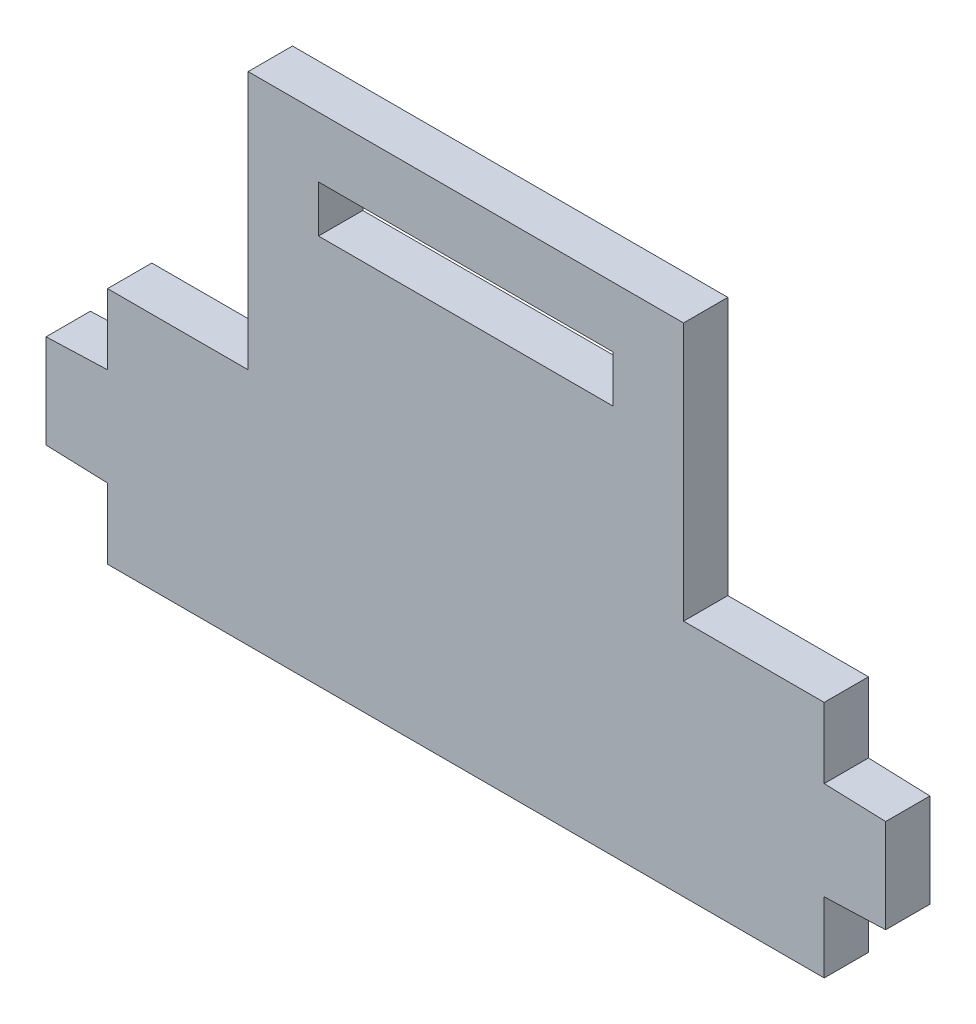
ISO-10303-21;
HEADER;
FILE_DESCRIPTION(('STEP AP214'),'2;1');
FILE_NAME('part.step','',(''),(''),'','','');
FILE_SCHEMA(('AUTOMOTIVE_DESIGN { 1 0 10303 214 1 1 1 1 }'));
ENDSEC;
DATA;
#1=APPLICATION_CONTEXT('core data for automotive mechanical design processes');
#2=APPLICATION_PROTOCOL_DEFINITION('international standard','automotive_design',2000,#1);
#3=PRODUCT_CONTEXT('',#1,'mechanical');
#4=PRODUCT('Part','Part','',(#3));
#5=PRODUCT_RELATED_PRODUCT_CATEGORY('part','',(#4));
#6=PRODUCT_DEFINITION_FORMATION('','',#4);
#7=PRODUCT_DEFINITION_CONTEXT('part definition',#1,'design');
#8=PRODUCT_DEFINITION('design','',#6,#7);
#9=PRODUCT_DEFINITION_SHAPE('','',#8);
#10=(LENGTH_UNIT() NAMED_UNIT(*) SI_UNIT(.MILLI.,.METRE.));
#11=(NAMED_UNIT(*) PLANE_ANGLE_UNIT() SI_UNIT($,.RADIAN.));
#12=(NAMED_UNIT(*) SI_UNIT($,.STERADIAN.) SOLID_ANGLE_UNIT());
#13=UNCERTAINTY_MEASURE_WITH_UNIT(LENGTH_MEASURE(1.E-05),#10,'distance_accuracy_value','');
#14=(GEOMETRIC_REPRESENTATION_CONTEXT(3) GLOBAL_UNCERTAINTY_ASSIGNED_CONTEXT((#13)) GLOBAL_UNIT_ASSIGNED_CONTEXT((#10,
#11,#12)) REPRESENTATION_CONTEXT('',''));
#15=CARTESIAN_POINT('',(0.,0.,0.));
#16=DIRECTION('',(0.,0.,1.));
#17=DIRECTION('',(1.,0.,0.));
#18=AXIS2_PLACEMENT_3D('',#15,#16,#17);
#19=CARTESIAN_POINT('',(48.5352783658156,182.165275629568,8.53999999997227));
#20=DIRECTION('',(1.,0.,0.));
#21=DIRECTION('',(0.,1.,0.));
#22=AXIS2_PLACEMENT_3D('',#19,#20,#21);
#23=PLANE('',#22);
#24=DIRECTION('',(0.,-1.,0.));
#25=VECTOR('',#24,1.);
#26=CARTESIAN_POINT('',(48.5352783658156,182.165275629568,2.53999999997227));
#27=LINE('',#26,#25);
#28=CARTESIAN_POINT('',(48.5352783658156,182.165275629568,2.53999999997227));
#29=VERTEX_POINT('',#28);
#30=CARTESIAN_POINT('',(48.5352783658156,172.640275629568,2.53999999997227));
#31=VERTEX_POINT('',#30);
#32=EDGE_CURVE('E203',#29,#31,#27,.T.);
#33=ORIENTED_EDGE('',*,*,#32,.F.);
#34=DIRECTION('',(0.,0.,-1.));
#35=VECTOR('',#34,1.);
#36=CARTESIAN_POINT('',(48.5352783658156,182.165275629568,8.53999999997227));
#37=LINE('',#36,#35);
#38=CARTESIAN_POINT('',(48.5352783658156,182.165275629568,8.53999999997227));
#39=VERTEX_POINT('',#38);
#40=EDGE_CURVE('E11',#39,#29,#37,.T.);
#41=ORIENTED_EDGE('',*,*,#40,.F.);
#42=DIRECTION('',(0.,-1.,0.));
#43=VECTOR('',#42,1.);
#44=CARTESIAN_POINT('',(48.5352783658156,182.165275629568,8.53999999997227));
#45=LINE('',#44,#43);
#46=CARTESIAN_POINT('',(48.5352783658156,172.640275629568,8.53999999997227));
#47=VERTEX_POINT('',#46);
#48=EDGE_CURVE('E207',#39,#47,#45,.T.);
#49=ORIENTED_EDGE('',*,*,#48,.T.);
#50=DIRECTION('',(0.,0.,-1.));
#51=VECTOR('',#50,1.);
#52=CARTESIAN_POINT('',(48.5352783658156,172.640275629568,8.53999999997227));
#53=LINE('',#52,#51);
#54=EDGE_CURVE('E36',#47,#31,#53,.T.);
#55=ORIENTED_EDGE('',*,*,#54,.T.);
#56=EDGE_LOOP('',(#33,#41,#49,#55));
#57=FACE_BOUND('',#56,.T.);
#58=ADVANCED_FACE('F33',(#57),#23,.T.);
#59=CARTESIAN_POINT('',(48.5352783658156,182.165275629568,8.53999999997227));
#60=DIRECTION('',(0.0348994967023862,-0.9993908270191,0.));
#61=DIRECTION('',(0.9993908270191,0.0348994967023862,0.));
#62=AXIS2_PLACEMENT_3D('',#59,#60,#61);
#63=PLANE('',#62);
#64=DIRECTION('',(-0.9993908270191,-0.0348994967023862,0.));
#65=VECTOR('',#64,1.);
#66=CARTESIAN_POINT('',(48.5352783658156,182.165275629568,2.53999999997227));
#67=LINE('',#66,#65);
#68=CARTESIAN_POINT('',(56.8598336654857,182.455975506308,2.53999999997227));
#69=VERTEX_POINT('',#68);
#70=EDGE_CURVE('E211',#69,#29,#67,.T.);
#71=ORIENTED_EDGE('',*,*,#70,.F.);
#72=DIRECTION('',(0.,0.,-1.));
#73=VECTOR('',#72,1.);
#74=CARTESIAN_POINT('',(56.8598336654857,182.455975506308,8.53999999997227));
#75=LINE('',#74,#73);
#76=CARTESIAN_POINT('',(56.8598336654857,182.455975506308,8.53999999997227));
#77=VERTEX_POINT('',#76);
#78=EDGE_CURVE('E41',#77,#69,#75,.T.);
#79=ORIENTED_EDGE('',*,*,#78,.F.);
#80=DIRECTION('',(-0.9993908270191,-0.0348994967023862,0.));
#81=VECTOR('',#80,1.);
#82=CARTESIAN_POINT('',(48.5352783658156,182.165275629568,8.53999999997227));
#83=LINE('',#82,#81);
#84=EDGE_CURVE('E253',#77,#39,#83,.T.);
#85=ORIENTED_EDGE('',*,*,#84,.T.);
#86=ORIENTED_EDGE('',*,*,#40,.T.);
#87=EDGE_LOOP('',(#71,#79,#85,#86));
#88=FACE_BOUND('',#87,.T.);
#89=ADVANCED_FACE('F340',(#88),#63,.T.);
#90=CARTESIAN_POINT('',(56.8598336654857,182.455975506308,8.53999999997227));
#91=DIRECTION('',(1.,0.,0.));
#92=DIRECTION('',(0.,1.,0.));
#93=AXIS2_PLACEMENT_3D('',#90,#91,#92);
#94=PLANE('',#93);
#95=DIRECTION('',(0.,-1.,0.));
#96=VECTOR('',#95,1.);
#97=CARTESIAN_POINT('',(56.8598336654857,182.455975506308,2.53999999997227));
#98=LINE('',#97,#96);
#99=CARTESIAN_POINT('',(56.8598336654857,195.155975506308,2.53999999997227));
#100=VERTEX_POINT('',#99);
#101=EDGE_CURVE('E297',#100,#69,#98,.T.);
#102=ORIENTED_EDGE('',*,*,#101,.F.);
#103=DIRECTION('',(0.,0.,-1.));
#104=VECTOR('',#103,1.);
#105=CARTESIAN_POINT('',(56.8598336654857,195.155975506308,8.53999999997227));
#106=LINE('',#105,#104);
#107=CARTESIAN_POINT('',(56.8598336654857,195.155975506308,8.53999999997227));
#108=VERTEX_POINT('',#107);
#109=EDGE_CURVE('E303',#108,#100,#106,.T.);
#110=ORIENTED_EDGE('',*,*,#109,.F.);
#111=DIRECTION('',(0.,-1.,0.));
#112=VECTOR('',#111,1.);
#113=CARTESIAN_POINT('',(56.8598336654857,182.455975506308,8.53999999997227));
#114=LINE('',#113,#112);
#115=EDGE_CURVE('E250',#108,#77,#114,.T.);
#116=ORIENTED_EDGE('',*,*,#115,.T.);
#117=ORIENTED_EDGE('',*,*,#78,.T.);
#118=EDGE_LOOP('',(#102,#110,#116,#117));
#119=FACE_BOUND('',#118,.T.);
#120=ADVANCED_FACE('F391',(#119),#94,.T.);
#121=CARTESIAN_POINT('',(56.8598336654857,195.155975506308,8.53999999997227));
#122=DIRECTION('',(0.0348994967024962,0.999390827019096,0.));
#123=DIRECTION('',(-0.999390827019096,0.0348994967024962,0.));
#124=AXIS2_PLACEMENT_3D('',#121,#122,#123);
#125=PLANE('',#124);
#126=DIRECTION('',(0.999390827019096,-0.0348994967024961,0.));
#127=VECTOR('',#126,1.);
#128=CARTESIAN_POINT('',(56.8598336654857,195.155975506308,2.53999999997227));
#129=LINE('',#128,#127);
#130=CARTESIAN_POINT('',(48.5352783658156,195.446675383049,2.53999999997227));
#131=VERTEX_POINT('',#130);
#132=EDGE_CURVE('E294',#131,#100,#129,.T.);
#133=ORIENTED_EDGE('',*,*,#132,.F.);
#134=DIRECTION('',(0.,0.,-1.));
#135=VECTOR('',#134,1.);
#136=CARTESIAN_POINT('',(48.5352783658156,195.446675383049,8.53999999997227));
#137=LINE('',#136,#135);
#138=CARTESIAN_POINT('',(48.5352783658156,195.446675383049,8.53999999997227));
#139=VERTEX_POINT('',#138);
#140=EDGE_CURVE('E305',#139,#131,#137,.T.);
#141=ORIENTED_EDGE('',*,*,#140,.F.);
#142=DIRECTION('',(0.999390827019096,-0.0348994967024961,0.));
#143=VECTOR('',#142,1.);
#144=CARTESIAN_POINT('',(56.8598336654857,195.155975506308,8.53999999997227));
#145=LINE('',#144,#143);
#146=EDGE_CURVE('E247',#139,#108,#145,.T.);
#147=ORIENTED_EDGE('',*,*,#146,.T.);
#148=ORIENTED_EDGE('',*,*,#109,.T.);
#149=EDGE_LOOP('',(#133,#141,#147,#148));
#150=FACE_BOUND('',#149,.T.);
#151=ADVANCED_FACE('F389',(#150),#125,.T.);
#152=CARTESIAN_POINT('',(48.5352783658156,195.446675383049,8.53999999997227));
#153=DIRECTION('',(1.,0.,0.));
#154=DIRECTION('',(0.,0.,-1.));
#155=AXIS2_PLACEMENT_3D('',#152,#153,#154);
#156=PLANE('',#155);
#157=DIRECTION('',(0.,-1.,0.));
#158=VECTOR('',#157,1.);
#159=CARTESIAN_POINT('',(48.5352783658156,195.446675383049,2.53999999997227));
#160=LINE('',#159,#158);
#161=CARTESIAN_POINT('',(48.5352783658156,204.971675383049,2.53999999997227));
#162=VERTEX_POINT('',#161);
#163=EDGE_CURVE('E291',#162,#131,#160,.T.);
#164=ORIENTED_EDGE('',*,*,#163,.F.);
#165=DIRECTION('',(0.,0.,-1.));
#166=VECTOR('',#165,1.);
#167=CARTESIAN_POINT('',(48.5352783658156,204.971675383049,8.53999999997227));
#168=LINE('',#167,#166);
#169=CARTESIAN_POINT('',(48.5352783658156,204.971675383049,8.53999999997227));
#170=VERTEX_POINT('',#169);
#171=EDGE_CURVE('E307',#170,#162,#168,.T.);
#172=ORIENTED_EDGE('',*,*,#171,.F.);
#173=DIRECTION('',(0.,-1.,0.));
#174=VECTOR('',#173,1.);
#175=CARTESIAN_POINT('',(48.5352783658156,195.446675383049,8.53999999997227));
#176=LINE('',#175,#174);
#177=EDGE_CURVE('E244',#170,#139,#176,.T.);
#178=ORIENTED_EDGE('',*,*,#177,.T.);
#179=ORIENTED_EDGE('',*,*,#140,.T.);
#180=EDGE_LOOP('',(#164,#172,#178,#179));
#181=FACE_BOUND('',#180,.T.);
#182=ADVANCED_FACE('F385',(#181),#156,.T.);
#183=CARTESIAN_POINT('',(48.5352783658156,204.971675383049,8.53999999997227));
#184=DIRECTION('',(0.,1.,0.));
#185=DIRECTION('',(0.,0.,1.));
#186=AXIS2_PLACEMENT_3D('',#183,#184,#185);
#187=PLANE('',#186);
#188=DIRECTION('',(1.,0.,0.));
#189=VECTOR('',#188,1.);
#190=CARTESIAN_POINT('',(48.5352783658156,204.971675383049,2.53999999997227));
#191=LINE('',#190,#189);
#192=CARTESIAN_POINT('',(29.4852783658156,204.971675383049,2.53999999997227));
#193=VERTEX_POINT('',#192);
#194=EDGE_CURVE('E288',#193,#162,#191,.T.);
#195=ORIENTED_EDGE('',*,*,#194,.F.);
#196=DIRECTION('',(0.,0.,-1.));
#197=VECTOR('',#196,1.);
#198=CARTESIAN_POINT('',(29.4852783658156,204.971675383049,8.53999999997227));
#199=LINE('',#198,#197);
#200=CARTESIAN_POINT('',(29.4852783658156,204.971675383049,8.53999999997227));
#201=VERTEX_POINT('',#200);
#202=EDGE_CURVE('E309',#201,#193,#199,.T.);
#203=ORIENTED_EDGE('',*,*,#202,.F.);
#204=DIRECTION('',(1.,0.,0.));
#205=VECTOR('',#204,1.);
#206=CARTESIAN_POINT('',(48.5352783658156,204.971675383049,8.53999999997227));
#207=LINE('',#206,#205);
#208=EDGE_CURVE('E241',#201,#170,#207,.T.);
#209=ORIENTED_EDGE('',*,*,#208,.T.);
#210=ORIENTED_EDGE('',*,*,#171,.T.);
#211=EDGE_LOOP('',(#195,#203,#209,#210));
#212=FACE_BOUND('',#211,.T.);
#213=ADVANCED_FACE('F381',(#212),#187,.T.);
#214=CARTESIAN_POINT('',(29.4852783658156,204.971675383049,8.53999999997227));
#215=DIRECTION('',(1.,0.,0.));
#216=DIRECTION('',(0.,1.,0.));
#217=AXIS2_PLACEMENT_3D('',#214,#215,#216);
#218=PLANE('',#217);
#219=DIRECTION('',(0.,-1.,0.));
#220=VECTOR('',#219,1.);
#221=CARTESIAN_POINT('',(29.4852783658156,204.971675383049,2.53999999997227));
#222=LINE('',#221,#220);
#223=CARTESIAN_POINT('',(29.4852783658156,239.9538,2.53999999997227));
#224=VERTEX_POINT('',#223);
#225=EDGE_CURVE('E285',#224,#193,#222,.T.);
#226=ORIENTED_EDGE('',*,*,#225,.F.);
#227=DIRECTION('',(0.,0.,-1.));
#228=VECTOR('',#227,1.);
#229=CARTESIAN_POINT('',(29.4852783658156,239.9538,8.53999999997227));
#230=LINE('',#229,#228);
#231=CARTESIAN_POINT('',(29.4852783658156,239.9538,8.53999999997227));
#232=VERTEX_POINT('',#231);
#233=EDGE_CURVE('E311',#232,#224,#230,.T.);
#234=ORIENTED_EDGE('',*,*,#233,.F.);
#235=DIRECTION('',(0.,-1.,0.));
#236=VECTOR('',#235,1.);
#237=CARTESIAN_POINT('',(29.4852783658156,204.971675383049,8.53999999997227));
#238=LINE('',#237,#236);
#239=EDGE_CURVE('E238',#232,#201,#238,.T.);
#240=ORIENTED_EDGE('',*,*,#239,.T.);
#241=ORIENTED_EDGE('',*,*,#202,.T.);
#242=EDGE_LOOP('',(#226,#234,#240,#241));
#243=FACE_BOUND('',#242,.T.);
#244=ADVANCED_FACE('F377',(#243),#218,.T.);
#245=CARTESIAN_POINT('',(-29.4852783658156,239.9538,8.53999999997227));
#246=DIRECTION('',(0.,1.,0.));
#247=DIRECTION('',(-1.,0.,0.));
#248=AXIS2_PLACEMENT_3D('',#245,#246,#247);
#249=PLANE('',#248);
#250=DIRECTION('',(1.,0.,0.));
#251=VECTOR('',#250,1.);
#252=CARTESIAN_POINT('',(-29.4852783658156,239.9538,2.53999999997227));
#253=LINE('',#252,#251);
#254=CARTESIAN_POINT('',(-29.4852783658156,239.9538,2.53999999997227));
#255=VERTEX_POINT('',#254);
#256=EDGE_CURVE('E282',#255,#224,#253,.T.);
#257=ORIENTED_EDGE('',*,*,#256,.F.);
#258=DIRECTION('',(0.,0.,-1.));
#259=VECTOR('',#258,1.);
#260=CARTESIAN_POINT('',(-29.4852783658156,239.9538,8.53999999997227));
#261=LINE('',#260,#259);
#262=CARTESIAN_POINT('',(-29.4852783658156,239.9538,8.53999999997227));
#263=VERTEX_POINT('',#262);
#264=EDGE_CURVE('E313',#263,#255,#261,.T.);
#265=ORIENTED_EDGE('',*,*,#264,.F.);
#266=DIRECTION('',(1.,0.,0.));
#267=VECTOR('',#266,1.);
#268=CARTESIAN_POINT('',(-29.4852783658156,239.9538,8.53999999997227));
#269=LINE('',#268,#267);
#270=EDGE_CURVE('E235',#263,#232,#269,.T.);
#271=ORIENTED_EDGE('',*,*,#270,.T.);
#272=ORIENTED_EDGE('',*,*,#233,.T.);
#273=EDGE_LOOP('',(#257,#265,#271,#272));
#274=FACE_BOUND('',#273,.T.);
#275=ADVANCED_FACE('F373',(#274),#249,.T.);
#276=CARTESIAN_POINT('',(-29.4852783658156,204.971675383051,8.53999999997227));
#277=DIRECTION('',(-1.,0.,0.));
#278=DIRECTION('',(0.,-1.,0.));
#279=AXIS2_PLACEMENT_3D('',#276,#277,#278);
#280=PLANE('',#279);
#281=DIRECTION('',(0.,1.,0.));
#282=VECTOR('',#281,1.);
#283=CARTESIAN_POINT('',(-29.4852783658156,204.971675383051,2.53999999997227));
#284=LINE('',#283,#282);
#285=CARTESIAN_POINT('',(-29.4852783658156,204.971675383051,2.53999999997227));
#286=VERTEX_POINT('',#285);
#287=EDGE_CURVE('E279',#286,#255,#284,.T.);
#288=ORIENTED_EDGE('',*,*,#287,.F.);
#289=DIRECTION('',(0.,0.,-1.));
#290=VECTOR('',#289,1.);
#291=CARTESIAN_POINT('',(-29.4852783658156,204.971675383051,8.53999999997227));
#292=LINE('',#291,#290);
#293=CARTESIAN_POINT('',(-29.4852783658156,204.971675383051,8.53999999997227));
#294=VERTEX_POINT('',#293);
#295=EDGE_CURVE('E315',#294,#286,#292,.T.);
#296=ORIENTED_EDGE('',*,*,#295,.F.);
#297=DIRECTION('',(0.,1.,0.));
#298=VECTOR('',#297,1.);
#299=CARTESIAN_POINT('',(-29.4852783658156,204.971675383051,8.53999999997227));
#300=LINE('',#299,#298);
#301=EDGE_CURVE('E232',#294,#263,#300,.T.);
#302=ORIENTED_EDGE('',*,*,#301,.T.);
#303=ORIENTED_EDGE('',*,*,#264,.T.);
#304=EDGE_LOOP('',(#288,#296,#302,#303));
#305=FACE_BOUND('',#304,.T.);
#306=ADVANCED_FACE('F369',(#305),#280,.T.);
#307=CARTESIAN_POINT('',(-48.5352783658156,204.971675383051,8.53999999997227));
#308=DIRECTION('',(0.,1.,0.));
#309=DIRECTION('',(0.,0.,1.));
#310=AXIS2_PLACEMENT_3D('',#307,#308,#309);
#311=PLANE('',#310);
#312=DIRECTION('',(1.,0.,0.));
#313=VECTOR('',#312,1.);
#314=CARTESIAN_POINT('',(-48.5352783658156,204.971675383051,2.53999999997227));
#315=LINE('',#314,#313);
#316=CARTESIAN_POINT('',(-48.5352783658156,204.971675383051,2.53999999997227));
#317=VERTEX_POINT('',#316);
#318=EDGE_CURVE('E276',#317,#286,#315,.T.);
#319=ORIENTED_EDGE('',*,*,#318,.F.);
#320=DIRECTION('',(0.,0.,-1.));
#321=VECTOR('',#320,1.);
#322=CARTESIAN_POINT('',(-48.5352783658156,204.971675383051,8.53999999997227));
#323=LINE('',#322,#321);
#324=CARTESIAN_POINT('',(-48.5352783658156,204.971675383051,8.53999999997227));
#325=VERTEX_POINT('',#324);
#326=EDGE_CURVE('E317',#325,#317,#323,.T.);
#327=ORIENTED_EDGE('',*,*,#326,.F.);
#328=DIRECTION('',(1.,0.,0.));
#329=VECTOR('',#328,1.);
#330=CARTESIAN_POINT('',(-48.5352783658156,204.971675383051,8.53999999997227));
#331=LINE('',#330,#329);
#332=EDGE_CURVE('E229',#325,#294,#331,.T.);
#333=ORIENTED_EDGE('',*,*,#332,.T.);
#334=ORIENTED_EDGE('',*,*,#295,.T.);
#335=EDGE_LOOP('',(#319,#327,#333,#334));
#336=FACE_BOUND('',#335,.T.);
#337=ADVANCED_FACE('F365',(#336),#311,.T.);
#338=CARTESIAN_POINT('',(-48.5352783658156,195.446675383051,8.53999999997227));
#339=DIRECTION('',(-1.,0.,0.));
#340=DIRECTION('',(0.,0.,1.));
#341=AXIS2_PLACEMENT_3D('',#338,#339,#340);
#342=PLANE('',#341);
#343=DIRECTION('',(0.,1.,0.));
#344=VECTOR('',#343,1.);
#345=CARTESIAN_POINT('',(-48.5352783658156,195.446675383051,2.53999999997227));
#346=LINE('',#345,#344);
#347=CARTESIAN_POINT('',(-48.5352783658156,195.446675383051,2.53999999997227));
#348=VERTEX_POINT('',#347);
#349=EDGE_CURVE('E273',#348,#317,#346,.T.);
#350=ORIENTED_EDGE('',*,*,#349,.F.);
#351=DIRECTION('',(0.,0.,-1.));
#352=VECTOR('',#351,1.);
#353=CARTESIAN_POINT('',(-48.5352783658156,195.446675383051,8.53999999997227));
#354=LINE('',#353,#352);
#355=CARTESIAN_POINT('',(-48.5352783658156,195.446675383051,8.53999999997227));
#356=VERTEX_POINT('',#355);
#357=EDGE_CURVE('E319',#356,#348,#354,.T.);
#358=ORIENTED_EDGE('',*,*,#357,.F.);
#359=DIRECTION('',(0.,1.,0.));
#360=VECTOR('',#359,1.);
#361=CARTESIAN_POINT('',(-48.5352783658156,195.446675383051,8.53999999997227));
#362=LINE('',#361,#360);
#363=EDGE_CURVE('E226',#356,#325,#362,.T.);
#364=ORIENTED_EDGE('',*,*,#363,.T.);
#365=ORIENTED_EDGE('',*,*,#326,.T.);
#366=EDGE_LOOP('',(#350,#358,#364,#365));
#367=FACE_BOUND('',#366,.T.);
#368=ADVANCED_FACE('F361',(#367),#342,.T.);
#369=CARTESIAN_POINT('',(-56.8598336654857,195.155975506309,8.53999999997227));
#370=DIRECTION('',(-0.0348994967025228,0.999390827019095,0.));
#371=DIRECTION('',(-0.999390827019095,-0.0348994967025228,0.));
#372=AXIS2_PLACEMENT_3D('',#369,#370,#371);
#373=PLANE('',#372);
#374=DIRECTION('',(0.999390827019095,0.0348994967025228,0.));
#375=VECTOR('',#374,1.);
#376=CARTESIAN_POINT('',(-56.8598336654857,195.155975506309,2.53999999997227));
#377=LINE('',#376,#375);
#378=CARTESIAN_POINT('',(-56.8598336654857,195.155975506309,2.53999999997227));
#379=VERTEX_POINT('',#378);
#380=EDGE_CURVE('E270',#379,#348,#377,.T.);
#381=ORIENTED_EDGE('',*,*,#380,.F.);
#382=DIRECTION('',(0.,0.,-1.));
#383=VECTOR('',#382,1.);
#384=CARTESIAN_POINT('',(-56.8598336654857,195.155975506309,8.53999999997227));
#385=LINE('',#384,#383);
#386=CARTESIAN_POINT('',(-56.8598336654857,195.155975506309,8.53999999997227));
#387=VERTEX_POINT('',#386);
#388=EDGE_CURVE('E321',#387,#379,#385,.T.);
#389=ORIENTED_EDGE('',*,*,#388,.F.);
#390=DIRECTION('',(0.999390827019095,0.0348994967025228,0.));
#391=VECTOR('',#390,1.);
#392=CARTESIAN_POINT('',(-56.8598336654857,195.155975506309,8.53999999997227));
#393=LINE('',#392,#391);
#394=EDGE_CURVE('E223',#387,#356,#393,.T.);
#395=ORIENTED_EDGE('',*,*,#394,.T.);
#396=ORIENTED_EDGE('',*,*,#357,.T.);
#397=EDGE_LOOP('',(#381,#389,#395,#396));
#398=FACE_BOUND('',#397,.T.);
#399=ADVANCED_FACE('F357',(#398),#373,.T.);
#400=CARTESIAN_POINT('',(-56.8598336654857,182.455975506309,8.53999999997227));
#401=DIRECTION('',(-1.,0.,0.));
#402=DIRECTION('',(0.,0.,1.));
#403=AXIS2_PLACEMENT_3D('',#400,#401,#402);
#404=PLANE('',#403);
#405=DIRECTION('',(0.,1.,0.));
#406=VECTOR('',#405,1.);
#407=CARTESIAN_POINT('',(-56.8598336654857,182.455975506309,2.53999999997227));
#408=LINE('',#407,#406);
#409=CARTESIAN_POINT('',(-56.8598336654857,182.455975506309,2.53999999997227));
#410=VERTEX_POINT('',#409);
#411=EDGE_CURVE('E267',#410,#379,#408,.T.);
#412=ORIENTED_EDGE('',*,*,#411,.F.);
#413=DIRECTION('',(0.,0.,-1.));
#414=VECTOR('',#413,1.);
#415=CARTESIAN_POINT('',(-56.8598336654857,182.455975506309,8.53999999997227));
#416=LINE('',#415,#414);
#417=CARTESIAN_POINT('',(-56.8598336654857,182.455975506309,8.53999999997227));
#418=VERTEX_POINT('',#417);
#419=EDGE_CURVE('E323',#418,#410,#416,.T.);
#420=ORIENTED_EDGE('',*,*,#419,.F.);
#421=DIRECTION('',(0.,1.,0.));
#422=VECTOR('',#421,1.);
#423=CARTESIAN_POINT('',(-56.8598336654857,182.455975506309,8.53999999997227));
#424=LINE('',#423,#422);
#425=EDGE_CURVE('E220',#418,#387,#424,.T.);
#426=ORIENTED_EDGE('',*,*,#425,.T.);
#427=ORIENTED_EDGE('',*,*,#388,.T.);
#428=EDGE_LOOP('',(#412,#420,#426,#427));
#429=FACE_BOUND('',#428,.T.);
#430=ADVANCED_FACE('F353',(#429),#404,.T.);
#431=CARTESIAN_POINT('',(-48.5352783658156,182.165275629568,8.53999999997227));
#432=DIRECTION('',(-0.0348994967025228,-0.999390827019095,0.));
#433=DIRECTION('',(0.999390827019095,-0.0348994967025228,0.));
#434=AXIS2_PLACEMENT_3D('',#431,#432,#433);
#435=PLANE('',#434);
#436=DIRECTION('',(-0.999390827019095,0.0348994967025228,0.));
#437=VECTOR('',#436,1.);
#438=CARTESIAN_POINT('',(-48.5352783658156,182.165275629568,2.53999999997227));
#439=LINE('',#438,#437);
#440=CARTESIAN_POINT('',(-48.5352783658156,182.165275629568,2.53999999997227));
#441=VERTEX_POINT('',#440);
#442=EDGE_CURVE('E264',#441,#410,#439,.T.);
#443=ORIENTED_EDGE('',*,*,#442,.F.);
#444=DIRECTION('',(0.,0.,-1.));
#445=VECTOR('',#444,1.);
#446=CARTESIAN_POINT('',(-48.5352783658156,182.165275629568,8.53999999997227));
#447=LINE('',#446,#445);
#448=CARTESIAN_POINT('',(-48.5352783658156,182.165275629568,8.53999999997227));
#449=VERTEX_POINT('',#448);
#450=EDGE_CURVE('E325',#449,#441,#447,.T.);
#451=ORIENTED_EDGE('',*,*,#450,.F.);
#452=DIRECTION('',(-0.999390827019095,0.0348994967025228,0.));
#453=VECTOR('',#452,1.);
#454=CARTESIAN_POINT('',(-48.5352783658156,182.165275629568,8.53999999997227));
#455=LINE('',#454,#453);
#456=EDGE_CURVE('E217',#449,#418,#455,.T.);
#457=ORIENTED_EDGE('',*,*,#456,.T.);
#458=ORIENTED_EDGE('',*,*,#419,.T.);
#459=EDGE_LOOP('',(#443,#451,#457,#458));
#460=FACE_BOUND('',#459,.T.);
#461=ADVANCED_FACE('F351',(#460),#435,.T.);
#462=CARTESIAN_POINT('',(-48.5352783658156,172.640275629568,8.53999999997227));
#463=DIRECTION('',(-1.,0.,0.));
#464=DIRECTION('',(0.,0.,1.));
#465=AXIS2_PLACEMENT_3D('',#462,#463,#464);
#466=PLANE('',#465);
#467=DIRECTION('',(0.,1.,0.));
#468=VECTOR('',#467,1.);
#469=CARTESIAN_POINT('',(-48.5352783658156,172.640275629568,2.53999999997227));
#470=LINE('',#469,#468);
#471=CARTESIAN_POINT('',(-48.5352783658156,172.640275629568,2.53999999997227));
#472=VERTEX_POINT('',#471);
#473=EDGE_CURVE('E261',#472,#441,#470,.T.);
#474=ORIENTED_EDGE('',*,*,#473,.F.);
#475=DIRECTION('',(0.,0.,-1.));
#476=VECTOR('',#475,1.);
#477=CARTESIAN_POINT('',(-48.5352783658156,172.640275629568,8.53999999997227));
#478=LINE('',#477,#476);
#479=CARTESIAN_POINT('',(-48.5352783658156,172.640275629568,8.53999999997227));
#480=VERTEX_POINT('',#479);
#481=EDGE_CURVE('E326',#480,#472,#478,.T.);
#482=ORIENTED_EDGE('',*,*,#481,.F.);
#483=DIRECTION('',(0.,1.,0.));
#484=VECTOR('',#483,1.);
#485=CARTESIAN_POINT('',(-48.5352783658156,172.640275629568,8.53999999997227));
#486=LINE('',#485,#484);
#487=EDGE_CURVE('E214',#480,#449,#486,.T.);
#488=ORIENTED_EDGE('',*,*,#487,.T.);
#489=ORIENTED_EDGE('',*,*,#450,.T.);
#490=EDGE_LOOP('',(#474,#482,#488,#489));
#491=FACE_BOUND('',#490,.T.);
#492=ADVANCED_FACE('F347',(#491),#466,.T.);
#493=CARTESIAN_POINT('',(48.5352783658156,172.640275629568,8.53999999997227));
#494=DIRECTION('',(0.,-1.,0.));
#495=DIRECTION('',(0.,0.,-1.));
#496=AXIS2_PLACEMENT_3D('',#493,#494,#495);
#497=PLANE('',#496);
#498=DIRECTION('',(-1.,0.,0.));
#499=VECTOR('',#498,1.);
#500=CARTESIAN_POINT('',(48.5352783658156,172.640275629568,2.53999999997227));
#501=LINE('',#500,#499);
#502=EDGE_CURVE('E258',#31,#472,#501,.T.);
#503=ORIENTED_EDGE('',*,*,#502,.F.);
#504=ORIENTED_EDGE('',*,*,#54,.F.);
#505=DIRECTION('',(-1.,0.,0.));
#506=VECTOR('',#505,1.);
#507=CARTESIAN_POINT('',(48.5352783658156,172.640275629568,8.53999999997227));
#508=LINE('',#507,#506);
#509=EDGE_CURVE('E210',#47,#480,#508,.T.);
#510=ORIENTED_EDGE('',*,*,#509,.T.);
#511=ORIENTED_EDGE('',*,*,#481,.T.);
#512=EDGE_LOOP('',(#503,#504,#510,#511));
#513=FACE_BOUND('',#512,.T.);
#514=ADVANCED_FACE('F334',(#513),#497,.T.);
#515=CARTESIAN_POINT('',(0.,0.,8.53999999997227));
#516=DIRECTION('',(0.,0.,-1.));
#517=DIRECTION('',(-1.,0.,0.));
#518=AXIS2_PLACEMENT_3D('',#515,#516,#517);
#519=PLANE('',#518);
#520=DIRECTION('',(1.,0.,0.));
#521=VECTOR('',#520,1.);
#522=CARTESIAN_POINT('',(19.9602783658155,231.775,8.53999999997227));
#523=LINE('',#522,#521);
#524=CARTESIAN_POINT('',(-19.9602783658155,231.775,8.53999999997227));
#525=VERTEX_POINT('',#524);
#526=CARTESIAN_POINT('',(19.9602783658155,231.775,8.53999999997227));
#527=VERTEX_POINT('',#526);
#528=EDGE_CURVE('E178',#525,#527,#523,.T.);
#529=ORIENTED_EDGE('',*,*,#528,.T.);
#530=DIRECTION('',(0.,-1.,0.));
#531=VECTOR('',#530,1.);
#532=CARTESIAN_POINT('',(19.9602783658155,231.775,8.53999999997227));
#533=LINE('',#532,#531);
#534=CARTESIAN_POINT('',(19.9602783658155,225.425,8.53999999997227));
#535=VERTEX_POINT('',#534);
#536=EDGE_CURVE('E172',#527,#535,#533,.T.);
#537=ORIENTED_EDGE('',*,*,#536,.T.);
#538=DIRECTION('',(-1.,0.,0.));
#539=VECTOR('',#538,1.);
#540=CARTESIAN_POINT('',(19.9602783658155,225.425,8.53999999997227));
#541=LINE('',#540,#539);
#542=CARTESIAN_POINT('',(-19.9602783658155,225.425,8.53999999997227));
#543=VERTEX_POINT('',#542);
#544=EDGE_CURVE('E181',#535,#543,#541,.T.);
#545=ORIENTED_EDGE('',*,*,#544,.T.);
#546=DIRECTION('',(0.,1.,0.));
#547=VECTOR('',#546,1.);
#548=CARTESIAN_POINT('',(-19.9602783658155,231.775,8.53999999997227));
#549=LINE('',#548,#547);
#550=EDGE_CURVE('E49',#543,#525,#549,.T.);
#551=ORIENTED_EDGE('',*,*,#550,.T.);
#552=EDGE_LOOP('',(#529,#537,#545,#551));
#553=FACE_BOUND('',#552,.T.);
#554=ORIENTED_EDGE('',*,*,#48,.F.);
#555=ORIENTED_EDGE('',*,*,#84,.F.);
#556=ORIENTED_EDGE('',*,*,#115,.F.);
#557=ORIENTED_EDGE('',*,*,#146,.F.);
#558=ORIENTED_EDGE('',*,*,#177,.F.);
#559=ORIENTED_EDGE('',*,*,#208,.F.);
#560=ORIENTED_EDGE('',*,*,#239,.F.);
#561=ORIENTED_EDGE('',*,*,#270,.F.);
#562=ORIENTED_EDGE('',*,*,#301,.F.);
#563=ORIENTED_EDGE('',*,*,#332,.F.);
#564=ORIENTED_EDGE('',*,*,#363,.F.);
#565=ORIENTED_EDGE('',*,*,#394,.F.);
#566=ORIENTED_EDGE('',*,*,#425,.F.);
#567=ORIENTED_EDGE('',*,*,#456,.F.);
#568=ORIENTED_EDGE('',*,*,#487,.F.);
#569=ORIENTED_EDGE('',*,*,#509,.F.);
#570=EDGE_LOOP('',(#554,#555,#556,#557,#558,#559,#560,#561,#562,#563,#564,#565,#566,#567,#568,#569));
#571=FACE_BOUND('',#570,.T.);
#572=ADVANCED_FACE('F185',(#553,#571),#519,.F.);
#573=CARTESIAN_POINT('',(0.,0.,2.53999999997227));
#574=DIRECTION('',(0.,0.,-1.));
#575=DIRECTION('',(-1.,0.,0.));
#576=AXIS2_PLACEMENT_3D('',#573,#574,#575);
#577=PLANE('',#576);
#578=DIRECTION('',(0.,-1.,0.));
#579=VECTOR('',#578,1.);
#580=CARTESIAN_POINT('',(19.9602783658155,231.775,2.53999999997227));
#581=LINE('',#580,#579);
#582=CARTESIAN_POINT('',(19.9602783658155,231.775,2.53999999997227));
#583=VERTEX_POINT('',#582);
#584=CARTESIAN_POINT('',(19.9602783658155,225.425,2.53999999997227));
#585=VERTEX_POINT('',#584);
#586=EDGE_CURVE('E57',#583,#585,#581,.T.);
#587=ORIENTED_EDGE('',*,*,#586,.F.);
#588=DIRECTION('',(1.,0.,0.));
#589=VECTOR('',#588,1.);
#590=CARTESIAN_POINT('',(19.9602783658155,231.775,2.53999999997227));
#591=LINE('',#590,#589);
#592=CARTESIAN_POINT('',(-19.9602783658155,231.775,2.53999999997227));
#593=VERTEX_POINT('',#592);
#594=EDGE_CURVE('E188',#593,#583,#591,.T.);
#595=ORIENTED_EDGE('',*,*,#594,.F.);
#596=DIRECTION('',(0.,1.,0.));
#597=VECTOR('',#596,1.);
#598=CARTESIAN_POINT('',(-19.9602783658155,231.775,2.53999999997227));
#599=LINE('',#598,#597);
#600=CARTESIAN_POINT('',(-19.9602783658155,225.425,2.53999999997227));
#601=VERTEX_POINT('',#600);
#602=EDGE_CURVE('E191',#601,#593,#599,.T.);
#603=ORIENTED_EDGE('',*,*,#602,.F.);
#604=DIRECTION('',(-1.,0.,0.));
#605=VECTOR('',#604,1.);
#606=CARTESIAN_POINT('',(19.9602783658155,225.425,2.53999999997227));
#607=LINE('',#606,#605);
#608=EDGE_CURVE('E197',#585,#601,#607,.T.);
#609=ORIENTED_EDGE('',*,*,#608,.F.);
#610=EDGE_LOOP('',(#587,#595,#603,#609));
#611=FACE_BOUND('',#610,.T.);
#612=ORIENTED_EDGE('',*,*,#32,.T.);
#613=ORIENTED_EDGE('',*,*,#502,.T.);
#614=ORIENTED_EDGE('',*,*,#473,.T.);
#615=ORIENTED_EDGE('',*,*,#442,.T.);
#616=ORIENTED_EDGE('',*,*,#411,.T.);
#617=ORIENTED_EDGE('',*,*,#380,.T.);
#618=ORIENTED_EDGE('',*,*,#349,.T.);
#619=ORIENTED_EDGE('',*,*,#318,.T.);
#620=ORIENTED_EDGE('',*,*,#287,.T.);
#621=ORIENTED_EDGE('',*,*,#256,.T.);
#622=ORIENTED_EDGE('',*,*,#225,.T.);
#623=ORIENTED_EDGE('',*,*,#194,.T.);
#624=ORIENTED_EDGE('',*,*,#163,.T.);
#625=ORIENTED_EDGE('',*,*,#132,.T.);
#626=ORIENTED_EDGE('',*,*,#101,.T.);
#627=ORIENTED_EDGE('',*,*,#70,.T.);
#628=EDGE_LOOP('',(#612,#613,#614,#615,#616,#617,#618,#619,#620,#621,#622,#623,#624,#625,#626,#627));
#629=FACE_BOUND('',#628,.T.);
#630=ADVANCED_FACE('F336',(#611,#629),#577,.T.);
#631=CARTESIAN_POINT('',(19.9602783658155,231.775,8.53999999997227));
#632=DIRECTION('',(1.,0.,0.));
#633=DIRECTION('',(0.,0.,-1.));
#634=AXIS2_PLACEMENT_3D('',#631,#632,#633);
#635=PLANE('',#634);
#636=ORIENTED_EDGE('',*,*,#586,.T.);
#637=DIRECTION('',(0.,0.,-1.));
#638=VECTOR('',#637,1.);
#639=CARTESIAN_POINT('',(19.9602783658155,225.425,8.53999999997227));
#640=LINE('',#639,#638);
#641=EDGE_CURVE('E168',#535,#585,#640,.T.);
#642=ORIENTED_EDGE('',*,*,#641,.F.);
#643=ORIENTED_EDGE('',*,*,#536,.F.);
#644=DIRECTION('',(0.,0.,-1.));
#645=VECTOR('',#644,1.);
#646=CARTESIAN_POINT('',(19.9602783658155,231.775,8.53999999997227));
#647=LINE('',#646,#645);
#648=EDGE_CURVE('E201',#527,#583,#647,.T.);
#649=ORIENTED_EDGE('',*,*,#648,.T.);
#650=EDGE_LOOP('',(#636,#642,#643,#649));
#651=FACE_BOUND('',#650,.T.);
#652=ADVANCED_FACE('F170',(#651),#635,.F.);
#653=CARTESIAN_POINT('',(19.9602783658155,231.775,8.53999999997227));
#654=DIRECTION('',(0.,1.,0.));
#655=DIRECTION('',(0.,0.,1.));
#656=AXIS2_PLACEMENT_3D('',#653,#654,#655);
#657=PLANE('',#656);
#658=ORIENTED_EDGE('',*,*,#594,.T.);
#659=ORIENTED_EDGE('',*,*,#648,.F.);
#660=ORIENTED_EDGE('',*,*,#528,.F.);
#661=DIRECTION('',(0.,0.,-1.));
#662=VECTOR('',#661,1.);
#663=CARTESIAN_POINT('',(-19.9602783658155,231.775,8.53999999997227));
#664=LINE('',#663,#662);
#665=EDGE_CURVE('E204',#525,#593,#664,.T.);
#666=ORIENTED_EDGE('',*,*,#665,.T.);
#667=EDGE_LOOP('',(#658,#659,#660,#666));
#668=FACE_BOUND('',#667,.T.);
#669=ADVANCED_FACE('F538',(#668),#657,.F.);
#670=CARTESIAN_POINT('',(-19.9602783658155,231.775,8.53999999997227));
#671=DIRECTION('',(-1.,0.,0.));
#672=DIRECTION('',(0.,0.,1.));
#673=AXIS2_PLACEMENT_3D('',#670,#671,#672);
#674=PLANE('',#673);
#675=ORIENTED_EDGE('',*,*,#602,.T.);
#676=ORIENTED_EDGE('',*,*,#665,.F.);
#677=ORIENTED_EDGE('',*,*,#550,.F.);
#678=DIRECTION('',(0.,0.,-1.));
#679=VECTOR('',#678,1.);
#680=CARTESIAN_POINT('',(-19.9602783658155,225.425,8.53999999997227));
#681=LINE('',#680,#679);
#682=EDGE_CURVE('E177',#543,#601,#681,.T.);
#683=ORIENTED_EDGE('',*,*,#682,.T.);
#684=EDGE_LOOP('',(#675,#676,#677,#683));
#685=FACE_BOUND('',#684,.T.);
#686=ADVANCED_FACE('F547',(#685),#674,.F.);
#687=CARTESIAN_POINT('',(19.9602783658155,225.425,8.53999999997227));
#688=DIRECTION('',(0.,-1.,0.));
#689=DIRECTION('',(0.,0.,-1.));
#690=AXIS2_PLACEMENT_3D('',#687,#688,#689);
#691=PLANE('',#690);
#692=ORIENTED_EDGE('',*,*,#608,.T.);
#693=ORIENTED_EDGE('',*,*,#682,.F.);
#694=ORIENTED_EDGE('',*,*,#544,.F.);
#695=ORIENTED_EDGE('',*,*,#641,.T.);
#696=EDGE_LOOP('',(#692,#693,#694,#695));
#697=FACE_BOUND('',#696,.T.);
#698=ADVANCED_FACE('F182',(#697),#691,.F.);
#699=CLOSED_SHELL('',(#58,#89,#120,#151,#182,#213,#244,#275,#306,#337,#368,#399,#430,#461,#492,
#514,#572,#630,#652,#669,#686,#698));
#700=MANIFOLD_SOLID_BREP('B2',#699);
#701=ADVANCED_BREP_SHAPE_REPRESENTATION('',(#18,#700),#14);
#702=SHAPE_DEFINITION_REPRESENTATION(#9,#701);
ENDSEC;
END-ISO-10303-21;
